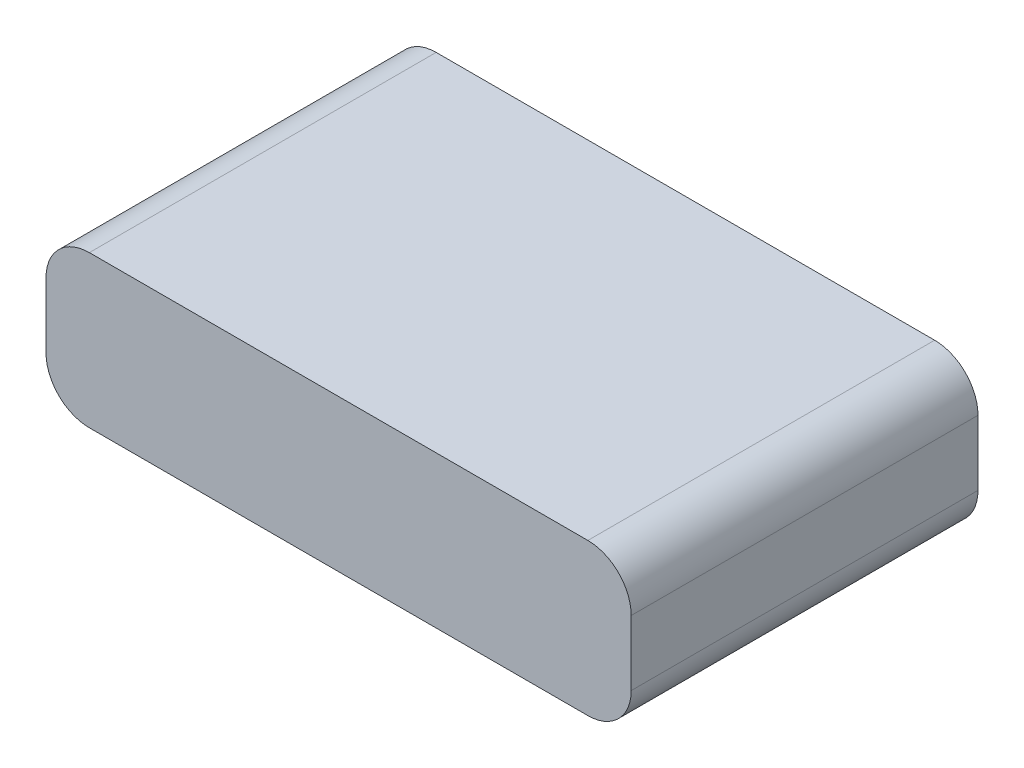
ISO-10303-21;
HEADER;
FILE_DESCRIPTION(('STEP AP214'),'2;1');
FILE_NAME('part.step','',(''),(''),'','','');
FILE_SCHEMA(('AUTOMOTIVE_DESIGN { 1 0 10303 214 1 1 1 1 }'));
ENDSEC;
DATA;
#1=APPLICATION_CONTEXT('core data for automotive mechanical design processes');
#2=APPLICATION_PROTOCOL_DEFINITION('international standard','automotive_design',2000,#1);
#3=PRODUCT_CONTEXT('',#1,'mechanical');
#4=PRODUCT('Part','Part','',(#3));
#5=PRODUCT_RELATED_PRODUCT_CATEGORY('part','',(#4));
#6=PRODUCT_DEFINITION_FORMATION('','',#4);
#7=PRODUCT_DEFINITION_CONTEXT('part definition',#1,'design');
#8=PRODUCT_DEFINITION('design','',#6,#7);
#9=PRODUCT_DEFINITION_SHAPE('','',#8);
#10=(LENGTH_UNIT() NAMED_UNIT(*) SI_UNIT(.MILLI.,.METRE.));
#11=(NAMED_UNIT(*) PLANE_ANGLE_UNIT() SI_UNIT($,.RADIAN.));
#12=(NAMED_UNIT(*) SI_UNIT($,.STERADIAN.) SOLID_ANGLE_UNIT());
#13=UNCERTAINTY_MEASURE_WITH_UNIT(LENGTH_MEASURE(1.E-05),#10,'distance_accuracy_value','');
#14=(GEOMETRIC_REPRESENTATION_CONTEXT(3) GLOBAL_UNCERTAINTY_ASSIGNED_CONTEXT((#13)) GLOBAL_UNIT_ASSIGNED_CONTEXT((#10,
#11,#12)) REPRESENTATION_CONTEXT('',''));
#15=CARTESIAN_POINT('',(0.,0.,0.));
#16=DIRECTION('',(0.,0.,1.));
#17=DIRECTION('',(1.,0.,0.));
#18=AXIS2_PLACEMENT_3D('',#15,#16,#17);
#19=CARTESIAN_POINT('',(0.,0.,80.));
#20=DIRECTION('',(1.,0.,0.));
#21=DIRECTION('',(0.,0.,-1.));
#22=AXIS2_PLACEMENT_3D('',#19,#20,#21);
#23=PLANE('',#22);
#24=DIRECTION('',(0.,-1.,0.));
#25=VECTOR('',#24,1.);
#26=CARTESIAN_POINT('',(0.,0.,80.));
#27=LINE('',#26,#25);
#28=CARTESIAN_POINT('',(0.,25.,80.));
#29=VERTEX_POINT('',#28);
#30=CARTESIAN_POINT('',(0.,10.,80.));
#31=VERTEX_POINT('',#30);
#32=EDGE_CURVE('E135',#29,#31,#27,.T.);
#33=ORIENTED_EDGE('',*,*,#32,.F.);
#34=DIRECTION('',(0.,0.,-1.));
#35=VECTOR('',#34,1.);
#36=CARTESIAN_POINT('',(0.,25.,80.));
#37=LINE('',#36,#35);
#38=CARTESIAN_POINT('',(0.,25.,0.));
#39=VERTEX_POINT('',#38);
#40=EDGE_CURVE('E11',#29,#39,#37,.T.);
#41=ORIENTED_EDGE('',*,*,#40,.T.);
#42=DIRECTION('',(0.,-1.,0.));
#43=VECTOR('',#42,1.);
#44=CARTESIAN_POINT('',(0.,0.,0.));
#45=LINE('',#44,#43);
#46=CARTESIAN_POINT('',(0.,10.,0.));
#47=VERTEX_POINT('',#46);
#48=EDGE_CURVE('E166',#39,#47,#45,.T.);
#49=ORIENTED_EDGE('',*,*,#48,.T.);
#50=DIRECTION('',(0.,0.,-1.));
#51=VECTOR('',#50,1.);
#52=CARTESIAN_POINT('',(0.,10.,80.));
#53=LINE('',#52,#51);
#54=EDGE_CURVE('E49',#47,#31,#53,.F.);
#55=ORIENTED_EDGE('',*,*,#54,.T.);
#56=EDGE_LOOP('',(#33,#41,#49,#55));
#57=FACE_BOUND('',#56,.T.);
#58=ADVANCED_FACE('F41',(#57),#23,.F.);
#59=CARTESIAN_POINT('',(0.,0.,80.));
#60=DIRECTION('',(0.,1.,0.));
#61=DIRECTION('',(0.,0.,1.));
#62=AXIS2_PLACEMENT_3D('',#59,#60,#61);
#63=PLANE('',#62);
#64=DIRECTION('',(1.,0.,0.));
#65=VECTOR('',#64,1.);
#66=CARTESIAN_POINT('',(0.,0.,0.));
#67=LINE('',#66,#65);
#68=CARTESIAN_POINT('',(10.,0.,0.));
#69=VERTEX_POINT('',#68);
#70=CARTESIAN_POINT('',(125.,0.,0.));
#71=VERTEX_POINT('',#70);
#72=EDGE_CURVE('E140',#69,#71,#67,.T.);
#73=ORIENTED_EDGE('',*,*,#72,.T.);
#74=DIRECTION('',(0.,0.,-1.));
#75=VECTOR('',#74,1.);
#76=CARTESIAN_POINT('',(125.,0.,80.));
#77=LINE('',#76,#75);
#78=CARTESIAN_POINT('',(125.,0.,80.));
#79=VERTEX_POINT('',#78);
#80=EDGE_CURVE('E56',#71,#79,#77,.F.);
#81=ORIENTED_EDGE('',*,*,#80,.T.);
#82=DIRECTION('',(1.,0.,0.));
#83=VECTOR('',#82,1.);
#84=CARTESIAN_POINT('',(0.,0.,80.));
#85=LINE('',#84,#83);
#86=CARTESIAN_POINT('',(10.,0.,80.));
#87=VERTEX_POINT('',#86);
#88=EDGE_CURVE('E138',#87,#79,#85,.T.);
#89=ORIENTED_EDGE('',*,*,#88,.F.);
#90=DIRECTION('',(0.,0.,-1.));
#91=VECTOR('',#90,1.);
#92=CARTESIAN_POINT('',(10.,0.,80.));
#93=LINE('',#92,#91);
#94=EDGE_CURVE('E158',#87,#69,#93,.T.);
#95=ORIENTED_EDGE('',*,*,#94,.T.);
#96=EDGE_LOOP('',(#73,#81,#89,#95));
#97=FACE_BOUND('',#96,.T.);
#98=ADVANCED_FACE('F173',(#97),#63,.F.);
#99=CARTESIAN_POINT('',(135.,0.,80.));
#100=DIRECTION('',(-1.,0.,0.));
#101=DIRECTION('',(0.,0.,1.));
#102=AXIS2_PLACEMENT_3D('',#99,#100,#101);
#103=PLANE('',#102);
#104=DIRECTION('',(0.,1.,0.));
#105=VECTOR('',#104,1.);
#106=CARTESIAN_POINT('',(135.,0.,0.));
#107=LINE('',#106,#105);
#108=CARTESIAN_POINT('',(135.,10.,0.));
#109=VERTEX_POINT('',#108);
#110=CARTESIAN_POINT('',(135.,25.,0.));
#111=VERTEX_POINT('',#110);
#112=EDGE_CURVE('E136',#109,#111,#107,.T.);
#113=ORIENTED_EDGE('',*,*,#112,.T.);
#114=DIRECTION('',(0.,0.,-1.));
#115=VECTOR('',#114,1.);
#116=CARTESIAN_POINT('',(135.,25.,80.));
#117=LINE('',#116,#115);
#118=CARTESIAN_POINT('',(135.,25.,80.));
#119=VERTEX_POINT('',#118);
#120=EDGE_CURVE('E113',#111,#119,#117,.F.);
#121=ORIENTED_EDGE('',*,*,#120,.T.);
#122=DIRECTION('',(0.,1.,0.));
#123=VECTOR('',#122,1.);
#124=CARTESIAN_POINT('',(135.,0.,80.));
#125=LINE('',#124,#123);
#126=CARTESIAN_POINT('',(135.,10.,80.));
#127=VERTEX_POINT('',#126);
#128=EDGE_CURVE('E177',#127,#119,#125,.T.);
#129=ORIENTED_EDGE('',*,*,#128,.F.);
#130=DIRECTION('',(0.,0.,-1.));
#131=VECTOR('',#130,1.);
#132=CARTESIAN_POINT('',(135.,10.,80.));
#133=LINE('',#132,#131);
#134=EDGE_CURVE('E118',#127,#109,#133,.T.);
#135=ORIENTED_EDGE('',*,*,#134,.T.);
#136=EDGE_LOOP('',(#113,#121,#129,#135));
#137=FACE_BOUND('',#136,.T.);
#138=ADVANCED_FACE('F185',(#137),#103,.F.);
#139=CARTESIAN_POINT('',(0.,35.,80.));
#140=DIRECTION('',(0.,-1.,0.));
#141=DIRECTION('',(0.,0.,-1.));
#142=AXIS2_PLACEMENT_3D('',#139,#140,#141);
#143=PLANE('',#142);
#144=DIRECTION('',(-1.,0.,0.));
#145=VECTOR('',#144,1.);
#146=CARTESIAN_POINT('',(0.,35.,80.));
#147=LINE('',#146,#145);
#148=CARTESIAN_POINT('',(125.,35.,80.));
#149=VERTEX_POINT('',#148);
#150=CARTESIAN_POINT('',(10.,35.,80.));
#151=VERTEX_POINT('',#150);
#152=EDGE_CURVE('E128',#149,#151,#147,.T.);
#153=ORIENTED_EDGE('',*,*,#152,.F.);
#154=DIRECTION('',(0.,0.,-1.));
#155=VECTOR('',#154,1.);
#156=CARTESIAN_POINT('',(125.,35.,80.));
#157=LINE('',#156,#155);
#158=CARTESIAN_POINT('',(125.,35.,0.));
#159=VERTEX_POINT('',#158);
#160=EDGE_CURVE('E112',#149,#159,#157,.T.);
#161=ORIENTED_EDGE('',*,*,#160,.T.);
#162=DIRECTION('',(-1.,0.,0.));
#163=VECTOR('',#162,1.);
#164=CARTESIAN_POINT('',(0.,35.,0.));
#165=LINE('',#164,#163);
#166=CARTESIAN_POINT('',(10.,35.,0.));
#167=VERTEX_POINT('',#166);
#168=EDGE_CURVE('E125',#159,#167,#165,.T.);
#169=ORIENTED_EDGE('',*,*,#168,.T.);
#170=DIRECTION('',(0.,0.,-1.));
#171=VECTOR('',#170,1.);
#172=CARTESIAN_POINT('',(10.,35.,80.));
#173=LINE('',#172,#171);
#174=EDGE_CURVE('E130',#167,#151,#173,.F.);
#175=ORIENTED_EDGE('',*,*,#174,.T.);
#176=EDGE_LOOP('',(#153,#161,#169,#175));
#177=FACE_BOUND('',#176,.T.);
#178=ADVANCED_FACE('F124',(#177),#143,.F.);
#179=CARTESIAN_POINT('',(0.,0.,80.));
#180=DIRECTION('',(0.,0.,-1.));
#181=DIRECTION('',(-1.,0.,0.));
#182=AXIS2_PLACEMENT_3D('',#179,#180,#181);
#183=PLANE('',#182);
#184=ORIENTED_EDGE('',*,*,#128,.T.);
#185=CARTESIAN_POINT('',(125.,25.,80.));
#186=DIRECTION('',(0.,0.,-1.));
#187=DIRECTION('',(-1.,0.,0.));
#188=AXIS2_PLACEMENT_3D('',#185,#186,#187);
#189=CIRCLE('',#188,10.);
#190=EDGE_CURVE('E156',#119,#149,#189,.F.);
#191=ORIENTED_EDGE('',*,*,#190,.T.);
#192=ORIENTED_EDGE('',*,*,#152,.T.);
#193=CARTESIAN_POINT('',(10.,25.,80.));
#194=DIRECTION('',(0.,0.,-1.));
#195=DIRECTION('',(-1.,0.,0.));
#196=AXIS2_PLACEMENT_3D('',#193,#194,#195);
#197=CIRCLE('',#196,10.);
#198=EDGE_CURVE('E152',#151,#29,#197,.F.);
#199=ORIENTED_EDGE('',*,*,#198,.T.);
#200=ORIENTED_EDGE('',*,*,#32,.T.);
#201=CARTESIAN_POINT('',(10.,10.,80.));
#202=DIRECTION('',(0.,0.,-1.));
#203=DIRECTION('',(-1.,0.,0.));
#204=AXIS2_PLACEMENT_3D('',#201,#202,#203);
#205=CIRCLE('',#204,10.);
#206=EDGE_CURVE('E63',#31,#87,#205,.F.);
#207=ORIENTED_EDGE('',*,*,#206,.T.);
#208=ORIENTED_EDGE('',*,*,#88,.T.);
#209=CARTESIAN_POINT('',(125.,10.,80.));
#210=DIRECTION('',(0.,0.,-1.));
#211=DIRECTION('',(-1.,0.,0.));
#212=AXIS2_PLACEMENT_3D('',#209,#210,#211);
#213=CIRCLE('',#212,10.);
#214=EDGE_CURVE('E154',#79,#127,#213,.F.);
#215=ORIENTED_EDGE('',*,*,#214,.T.);
#216=EDGE_LOOP('',(#184,#191,#192,#199,#200,#207,#208,#215));
#217=FACE_BOUND('',#216,.T.);
#218=ADVANCED_FACE('F169',(#217),#183,.F.);
#219=CARTESIAN_POINT('',(0.,0.,0.));
#220=DIRECTION('',(0.,0.,-1.));
#221=DIRECTION('',(-1.,0.,0.));
#222=AXIS2_PLACEMENT_3D('',#219,#220,#221);
#223=PLANE('',#222);
#224=ORIENTED_EDGE('',*,*,#168,.F.);
#225=CARTESIAN_POINT('',(125.,25.,0.));
#226=DIRECTION('',(0.,0.,-1.));
#227=DIRECTION('',(-1.,0.,0.));
#228=AXIS2_PLACEMENT_3D('',#225,#226,#227);
#229=CIRCLE('',#228,10.);
#230=EDGE_CURVE('E108',#159,#111,#229,.T.);
#231=ORIENTED_EDGE('',*,*,#230,.T.);
#232=ORIENTED_EDGE('',*,*,#112,.F.);
#233=CARTESIAN_POINT('',(125.,10.,0.));
#234=DIRECTION('',(0.,0.,-1.));
#235=DIRECTION('',(-1.,0.,0.));
#236=AXIS2_PLACEMENT_3D('',#233,#234,#235);
#237=CIRCLE('',#236,10.);
#238=EDGE_CURVE('E119',#109,#71,#237,.T.);
#239=ORIENTED_EDGE('',*,*,#238,.T.);
#240=ORIENTED_EDGE('',*,*,#72,.F.);
#241=CARTESIAN_POINT('',(10.,10.,0.));
#242=DIRECTION('',(0.,0.,-1.));
#243=DIRECTION('',(-1.,0.,0.));
#244=AXIS2_PLACEMENT_3D('',#241,#242,#243);
#245=CIRCLE('',#244,10.);
#246=EDGE_CURVE('E129',#69,#47,#245,.T.);
#247=ORIENTED_EDGE('',*,*,#246,.T.);
#248=ORIENTED_EDGE('',*,*,#48,.F.);
#249=CARTESIAN_POINT('',(10.,25.,0.));
#250=DIRECTION('',(0.,0.,-1.));
#251=DIRECTION('',(-1.,0.,0.));
#252=AXIS2_PLACEMENT_3D('',#249,#250,#251);
#253=CIRCLE('',#252,10.);
#254=EDGE_CURVE('E134',#39,#167,#253,.T.);
#255=ORIENTED_EDGE('',*,*,#254,.T.);
#256=EDGE_LOOP('',(#224,#231,#232,#239,#240,#247,#248,#255));
#257=FACE_BOUND('',#256,.T.);
#258=ADVANCED_FACE('F132',(#257),#223,.T.);
#259=CARTESIAN_POINT('',(125.,25.,80.));
#260=DIRECTION('',(0.,0.,-1.));
#261=DIRECTION('',(-1.,0.,0.));
#262=AXIS2_PLACEMENT_3D('',#259,#260,#261);
#263=CYLINDRICAL_SURFACE('',#262,10.);
#264=ORIENTED_EDGE('',*,*,#190,.F.);
#265=ORIENTED_EDGE('',*,*,#120,.F.);
#266=ORIENTED_EDGE('',*,*,#230,.F.);
#267=ORIENTED_EDGE('',*,*,#160,.F.);
#268=EDGE_LOOP('',(#264,#265,#266,#267));
#269=FACE_BOUND('',#268,.T.);
#270=ADVANCED_FACE('F111',(#269),#263,.T.);
#271=CARTESIAN_POINT('',(125.,10.,80.));
#272=DIRECTION('',(0.,0.,-1.));
#273=DIRECTION('',(-1.,0.,0.));
#274=AXIS2_PLACEMENT_3D('',#271,#272,#273);
#275=CYLINDRICAL_SURFACE('',#274,10.);
#276=ORIENTED_EDGE('',*,*,#214,.F.);
#277=ORIENTED_EDGE('',*,*,#80,.F.);
#278=ORIENTED_EDGE('',*,*,#238,.F.);
#279=ORIENTED_EDGE('',*,*,#134,.F.);
#280=EDGE_LOOP('',(#276,#277,#278,#279));
#281=FACE_BOUND('',#280,.T.);
#282=ADVANCED_FACE('F183',(#281),#275,.T.);
#283=CARTESIAN_POINT('',(10.,25.,80.));
#284=DIRECTION('',(0.,0.,-1.));
#285=DIRECTION('',(-1.,0.,0.));
#286=AXIS2_PLACEMENT_3D('',#283,#284,#285);
#287=CYLINDRICAL_SURFACE('',#286,10.);
#288=ORIENTED_EDGE('',*,*,#198,.F.);
#289=ORIENTED_EDGE('',*,*,#174,.F.);
#290=ORIENTED_EDGE('',*,*,#254,.F.);
#291=ORIENTED_EDGE('',*,*,#40,.F.);
#292=EDGE_LOOP('',(#288,#289,#290,#291));
#293=FACE_BOUND('',#292,.T.);
#294=ADVANCED_FACE('F187',(#293),#287,.T.);
#295=CARTESIAN_POINT('',(10.,10.,80.));
#296=DIRECTION('',(0.,0.,-1.));
#297=DIRECTION('',(-1.,0.,0.));
#298=AXIS2_PLACEMENT_3D('',#295,#296,#297);
#299=CYLINDRICAL_SURFACE('',#298,10.);
#300=ORIENTED_EDGE('',*,*,#206,.F.);
#301=ORIENTED_EDGE('',*,*,#54,.F.);
#302=ORIENTED_EDGE('',*,*,#246,.F.);
#303=ORIENTED_EDGE('',*,*,#94,.F.);
#304=EDGE_LOOP('',(#300,#301,#302,#303));
#305=FACE_BOUND('',#304,.T.);
#306=ADVANCED_FACE('F43',(#305),#299,.T.);
#307=CLOSED_SHELL('',(#58,#98,#138,#178,#218,#258,#270,#282,#294,#306));
#308=MANIFOLD_SOLID_BREP('B2',#307);
#309=ADVANCED_BREP_SHAPE_REPRESENTATION('',(#18,#308),#14);
#310=SHAPE_DEFINITION_REPRESENTATION(#9,#309);
ENDSEC;
END-ISO-10303-21;
